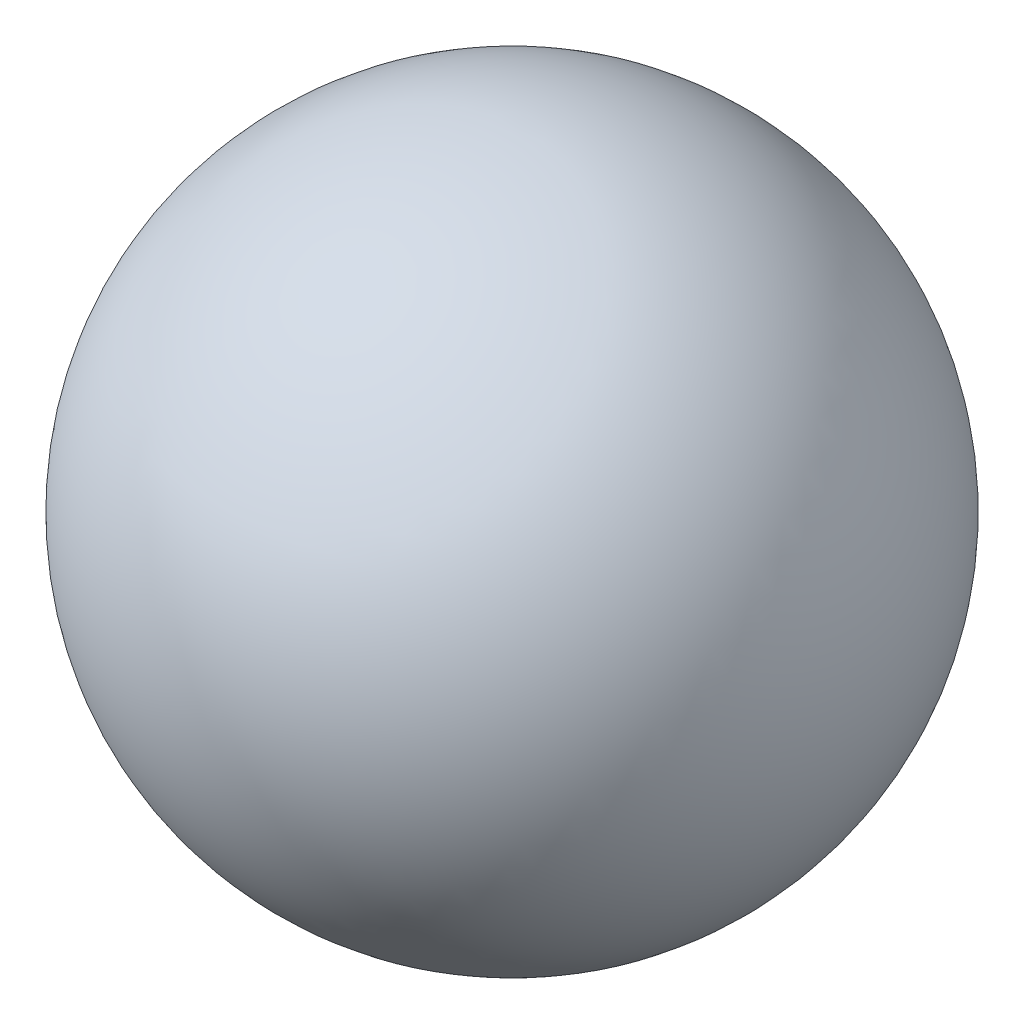
ISO-10303-21;
HEADER;
FILE_DESCRIPTION(('STEP AP214'),'2;1');
FILE_NAME('part.step','',(''),(''),'','','');
FILE_SCHEMA(('AUTOMOTIVE_DESIGN { 1 0 10303 214 1 1 1 1 }'));
ENDSEC;
DATA;
#1=APPLICATION_CONTEXT('core data for automotive mechanical design processes');
#2=APPLICATION_PROTOCOL_DEFINITION('international standard','automotive_design',2000,#1);
#3=PRODUCT_CONTEXT('',#1,'mechanical');
#4=PRODUCT('Part','Part','',(#3));
#5=PRODUCT_RELATED_PRODUCT_CATEGORY('part','',(#4));
#6=PRODUCT_DEFINITION_FORMATION('','',#4);
#7=PRODUCT_DEFINITION_CONTEXT('part definition',#1,'design');
#8=PRODUCT_DEFINITION('design','',#6,#7);
#9=PRODUCT_DEFINITION_SHAPE('','',#8);
#10=(LENGTH_UNIT() NAMED_UNIT(*) SI_UNIT(.MILLI.,.METRE.));
#11=(NAMED_UNIT(*) PLANE_ANGLE_UNIT() SI_UNIT($,.RADIAN.));
#12=(NAMED_UNIT(*) SI_UNIT($,.STERADIAN.) SOLID_ANGLE_UNIT());
#13=UNCERTAINTY_MEASURE_WITH_UNIT(LENGTH_MEASURE(1.E-05),#10,'distance_accuracy_value','');
#14=(GEOMETRIC_REPRESENTATION_CONTEXT(3) GLOBAL_UNCERTAINTY_ASSIGNED_CONTEXT((#13)) GLOBAL_UNIT_ASSIGNED_CONTEXT((#10,
#11,#12)) REPRESENTATION_CONTEXT('',''));
#15=CARTESIAN_POINT('',(0.,0.,0.));
#16=DIRECTION('',(0.,0.,1.));
#17=DIRECTION('',(1.,0.,0.));
#18=AXIS2_PLACEMENT_3D('',#15,#16,#17);
#19=CARTESIAN_POINT('',(0.,0.,0.));
#20=DIRECTION('',(0.,1.,0.));
#21=DIRECTION('',(1.,0.,0.));
#22=AXIS2_PLACEMENT_3D('',#19,#20,#21);
#23=SPHERICAL_SURFACE('',#22,7.);
#24=CARTESIAN_POINT('',(0.,7.,0.));
#25=VERTEX_POINT('',#24);
#26=VERTEX_LOOP('',#25);
#27=FACE_BOUND('',#26,.T.);
#28=ADVANCED_FACE('F37',(#27),#23,.T.);
#29=CLOSED_SHELL('',(#28));
#30=MANIFOLD_SOLID_BREP('B2',#29);
#31=ADVANCED_BREP_SHAPE_REPRESENTATION('',(#18,#30),#14);
#32=SHAPE_DEFINITION_REPRESENTATION(#9,#31);
ENDSEC;
END-ISO-10303-21;
